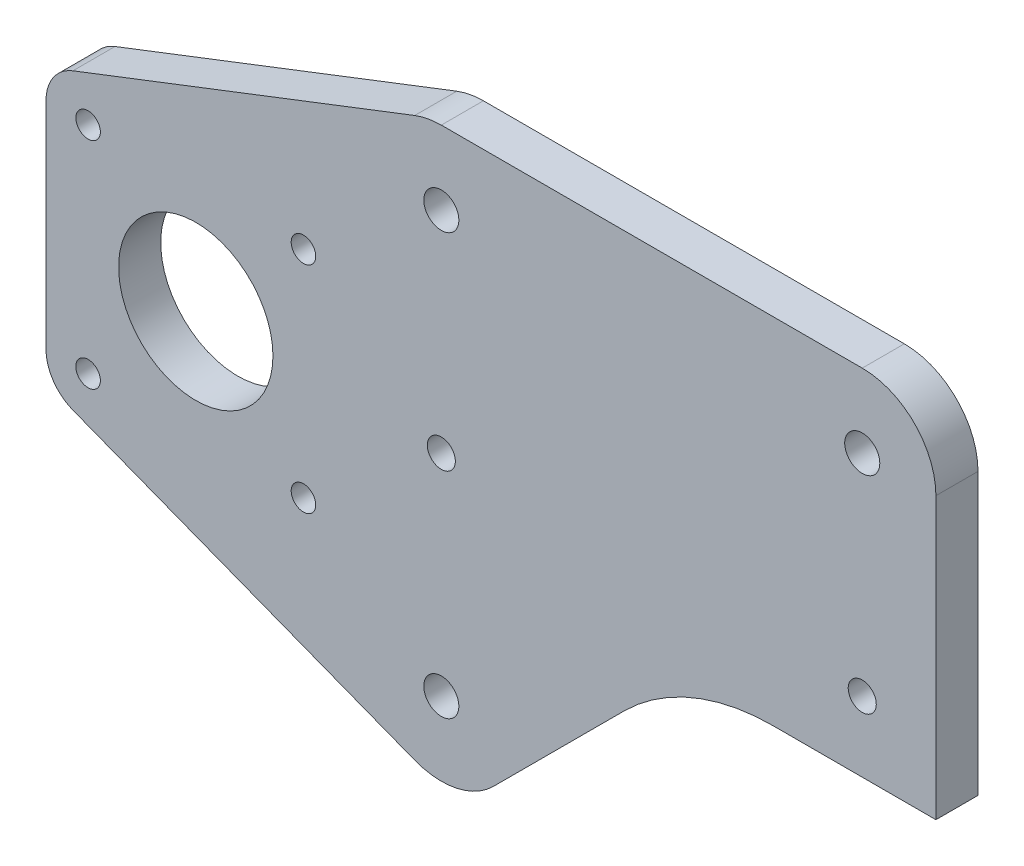
ISO-10303-21;
HEADER;
FILE_DESCRIPTION(('STEP AP214'),'2;1');
FILE_NAME('part.step','',(''),(''),'','','');
FILE_SCHEMA(('AUTOMOTIVE_DESIGN { 1 0 10303 214 1 1 1 1 }'));
ENDSEC;
DATA;
#1=APPLICATION_CONTEXT('core data for automotive mechanical design processes');
#2=APPLICATION_PROTOCOL_DEFINITION('international standard','automotive_design',2000,#1);
#3=PRODUCT_CONTEXT('',#1,'mechanical');
#4=PRODUCT('Part','Part','',(#3));
#5=PRODUCT_RELATED_PRODUCT_CATEGORY('part','',(#4));
#6=PRODUCT_DEFINITION_FORMATION('','',#4);
#7=PRODUCT_DEFINITION_CONTEXT('part definition',#1,'design');
#8=PRODUCT_DEFINITION('design','',#6,#7);
#9=PRODUCT_DEFINITION_SHAPE('','',#8);
#10=(LENGTH_UNIT() NAMED_UNIT(*) SI_UNIT(.MILLI.,.METRE.));
#11=(NAMED_UNIT(*) PLANE_ANGLE_UNIT() SI_UNIT($,.RADIAN.));
#12=(NAMED_UNIT(*) SI_UNIT($,.STERADIAN.) SOLID_ANGLE_UNIT());
#13=UNCERTAINTY_MEASURE_WITH_UNIT(LENGTH_MEASURE(1.E-05),#10,'distance_accuracy_value','');
#14=(GEOMETRIC_REPRESENTATION_CONTEXT(3) GLOBAL_UNCERTAINTY_ASSIGNED_CONTEXT((#13)) GLOBAL_UNIT_ASSIGNED_CONTEXT((#10,
#11,#12)) REPRESENTATION_CONTEXT('',''));
#15=CARTESIAN_POINT('',(0.,0.,0.));
#16=DIRECTION('',(0.,0.,1.));
#17=DIRECTION('',(1.,0.,0.));
#18=AXIS2_PLACEMENT_3D('',#15,#16,#17);
#19=CARTESIAN_POINT('',(17.2756492761104,-40.,6.));
#20=DIRECTION('',(0.,0.,1.));
#21=DIRECTION('',(1.,0.,0.));
#22=AXIS2_PLACEMENT_3D('',#19,#20,#21);
#23=PLANE('',#22);
#24=CARTESIAN_POINT('',(30.,0.,6.));
#25=DIRECTION('',(0.,0.,1.));
#26=DIRECTION('',(1.,0.,0.));
#27=AXIS2_PLACEMENT_3D('',#24,#25,#26);
#28=CIRCLE('',#27,2.);
#29=CARTESIAN_POINT('',(32.,0.,6.));
#30=VERTEX_POINT('',#29);
#31=EDGE_CURVE('E328',#30,#30,#28,.T.);
#32=ORIENTED_EDGE('',*,*,#31,.F.);
#33=EDGE_LOOP('',(#32));
#34=FACE_BOUND('',#33,.T.);
#35=CARTESIAN_POINT('',(-49.6509007052459,-15.3490992947541,6.));
#36=DIRECTION('',(0.,0.,1.));
#37=DIRECTION('',(1.,0.,0.));
#38=AXIS2_PLACEMENT_3D('',#35,#36,#37);
#39=CIRCLE('',#38,1.75);
#40=CARTESIAN_POINT('',(-47.9009007052459,-15.3490992947541,6.));
#41=VERTEX_POINT('',#40);
#42=EDGE_CURVE('E340',#41,#41,#39,.T.);
#43=ORIENTED_EDGE('',*,*,#42,.F.);
#44=EDGE_LOOP('',(#43));
#45=FACE_BOUND('',#44,.T.);
#46=CARTESIAN_POINT('',(-65.,0.,6.));
#47=DIRECTION('',(0.,0.,1.));
#48=DIRECTION('',(1.,0.,0.));
#49=AXIS2_PLACEMENT_3D('',#46,#47,#48);
#50=CIRCLE('',#49,11.);
#51=CARTESIAN_POINT('',(-54.,0.,6.));
#52=VERTEX_POINT('',#51);
#53=EDGE_CURVE('E352',#52,#52,#50,.T.);
#54=ORIENTED_EDGE('',*,*,#53,.F.);
#55=EDGE_LOOP('',(#54));
#56=FACE_BOUND('',#55,.T.);
#57=CARTESIAN_POINT('',(30.,30.,6.));
#58=DIRECTION('',(0.,0.,1.));
#59=DIRECTION('',(1.,0.,0.));
#60=AXIS2_PLACEMENT_3D('',#57,#58,#59);
#61=CIRCLE('',#60,2.5);
#62=CARTESIAN_POINT('',(32.5,30.,6.));
#63=VERTEX_POINT('',#62);
#64=EDGE_CURVE('E364',#63,#63,#61,.T.);
#65=ORIENTED_EDGE('',*,*,#64,.F.);
#66=EDGE_LOOP('',(#65));
#67=FACE_BOUND('',#66,.T.);
#68=CARTESIAN_POINT('',(-30.,30.,6.));
#69=DIRECTION('',(0.,0.,1.));
#70=DIRECTION('',(1.,0.,0.));
#71=AXIS2_PLACEMENT_3D('',#68,#69,#70);
#72=CIRCLE('',#71,2.5);
#73=CARTESIAN_POINT('',(-27.5,30.,6.));
#74=VERTEX_POINT('',#73);
#75=EDGE_CURVE('E164',#74,#74,#72,.T.);
#76=ORIENTED_EDGE('',*,*,#75,.F.);
#77=EDGE_LOOP('',(#76));
#78=FACE_BOUND('',#77,.T.);
#79=CARTESIAN_POINT('',(17.2756492761104,-40.,6.));
#80=DIRECTION('',(0.,0.,-1.));
#81=DIRECTION('',(1.,0.,0.));
#82=AXIS2_PLACEMENT_3D('',#79,#80,#81);
#83=CIRCLE('',#82,30.);
#84=CARTESIAN_POINT('',(-3.93755415948607,-18.7867965644036,6.));
#85=VERTEX_POINT('',#84);
#86=CARTESIAN_POINT('',(17.2756492761104,-10.,6.));
#87=VERTEX_POINT('',#86);
#88=EDGE_CURVE('E185',#85,#87,#83,.T.);
#89=ORIENTED_EDGE('',*,*,#88,.T.);
#90=DIRECTION('',(1.,0.,0.));
#91=VECTOR('',#90,1.);
#92=CARTESIAN_POINT('',(17.2756492761104,-10.,6.));
#93=LINE('',#92,#91);
#94=CARTESIAN_POINT('',(40.5,-10.,6.));
#95=VERTEX_POINT('',#94);
#96=EDGE_CURVE('E108',#87,#95,#93,.T.);
#97=ORIENTED_EDGE('',*,*,#96,.T.);
#98=DIRECTION('',(0.,1.,0.));
#99=VECTOR('',#98,1.);
#100=CARTESIAN_POINT('',(40.5,30.,6.));
#101=LINE('',#100,#99);
#102=CARTESIAN_POINT('',(40.5,30.,6.));
#103=VERTEX_POINT('',#102);
#104=EDGE_CURVE('E215',#95,#103,#101,.T.);
#105=ORIENTED_EDGE('',*,*,#104,.T.);
#106=CARTESIAN_POINT('',(30.,30.,6.));
#107=DIRECTION('',(0.,0.,1.));
#108=DIRECTION('',(1.,0.,0.));
#109=AXIS2_PLACEMENT_3D('',#106,#107,#108);
#110=CIRCLE('',#109,10.5);
#111=CARTESIAN_POINT('',(30.,40.5,6.));
#112=VERTEX_POINT('',#111);
#113=EDGE_CURVE('E234',#103,#112,#110,.T.);
#114=ORIENTED_EDGE('',*,*,#113,.T.);
#115=DIRECTION('',(-1.,0.,0.));
#116=VECTOR('',#115,1.);
#117=CARTESIAN_POINT('',(30.,40.5,6.));
#118=LINE('',#117,#116);
#119=CARTESIAN_POINT('',(-30.,40.5,6.));
#120=VERTEX_POINT('',#119);
#121=EDGE_CURVE('E231',#112,#120,#118,.T.);
#122=ORIENTED_EDGE('',*,*,#121,.T.);
#123=CARTESIAN_POINT('',(-30.,30.,6.));
#124=DIRECTION('',(0.,0.,1.));
#125=DIRECTION('',(1.,0.,0.));
#126=AXIS2_PLACEMENT_3D('',#123,#124,#125);
#127=CIRCLE('',#126,10.5);
#128=CARTESIAN_POINT('',(-33.7880453663849,39.7928909062753,6.));
#129=VERTEX_POINT('',#128);
#130=EDGE_CURVE('E233',#120,#129,#127,.T.);
#131=ORIENTED_EDGE('',*,*,#130,.T.);
#132=DIRECTION('',(-0.932656276788127,-0.360766225369988,0.));
#133=VECTOR('',#132,1.);
#134=CARTESIAN_POINT('',(-33.7880453663849,39.7928909062753,6.));
#135=LINE('',#134,#133);
#136=CARTESIAN_POINT('',(-82.513696646974,20.9450369554829,6.));
#137=VERTEX_POINT('',#136);
#138=EDGE_CURVE('E236',#129,#137,#135,.T.);
#139=ORIENTED_EDGE('',*,*,#138,.T.);
#140=CARTESIAN_POINT('',(-80.3490992947541,15.3490992947541,6.));
#141=DIRECTION('',(0.,0.,1.));
#142=DIRECTION('',(1.,0.,0.));
#143=AXIS2_PLACEMENT_3D('',#140,#141,#142);
#144=CIRCLE('',#143,6.00000000000001);
#145=CARTESIAN_POINT('',(-86.3490992947541,15.3490992947541,6.));
#146=VERTEX_POINT('',#145);
#147=EDGE_CURVE('E242',#137,#146,#144,.T.);
#148=ORIENTED_EDGE('',*,*,#147,.T.);
#149=DIRECTION('',(0.,-1.,0.));
#150=VECTOR('',#149,1.);
#151=CARTESIAN_POINT('',(-86.3490992947541,15.3490992947541,6.));
#152=LINE('',#151,#150);
#153=CARTESIAN_POINT('',(-86.3490992947541,-15.3490992947541,6.));
#154=VERTEX_POINT('',#153);
#155=EDGE_CURVE('E244',#146,#154,#152,.T.);
#156=ORIENTED_EDGE('',*,*,#155,.T.);
#157=CARTESIAN_POINT('',(-80.3490992947541,-15.3490992947541,6.));
#158=DIRECTION('',(0.,0.,1.));
#159=DIRECTION('',(1.,0.,0.));
#160=AXIS2_PLACEMENT_3D('',#157,#158,#159);
#161=CIRCLE('',#160,6.00000000000001);
#162=CARTESIAN_POINT('',(-82.513696646974,-20.9450369554829,6.));
#163=VERTEX_POINT('',#162);
#164=EDGE_CURVE('E142',#154,#163,#161,.T.);
#165=ORIENTED_EDGE('',*,*,#164,.T.);
#166=DIRECTION('',(0.932656276788127,-0.360766225369988,0.));
#167=VECTOR('',#166,1.);
#168=CARTESIAN_POINT('',(-33.7880453663849,-39.7928909062753,6.));
#169=LINE('',#168,#167);
#170=CARTESIAN_POINT('',(-33.7880453663849,-39.7928909062753,6.));
#171=VERTEX_POINT('',#170);
#172=EDGE_CURVE('E136',#163,#171,#169,.T.);
#173=ORIENTED_EDGE('',*,*,#172,.T.);
#174=CARTESIAN_POINT('',(-30.,-30.,6.));
#175=DIRECTION('',(0.,0.,1.));
#176=DIRECTION('',(1.,0.,0.));
#177=AXIS2_PLACEMENT_3D('',#174,#175,#176);
#178=CIRCLE('',#177,10.5);
#179=CARTESIAN_POINT('',(-22.5753787975412,-37.4246212024588,6.));
#180=VERTEX_POINT('',#179);
#181=EDGE_CURVE('E140',#171,#180,#178,.T.);
#182=ORIENTED_EDGE('',*,*,#181,.T.);
#183=DIRECTION('',(0.707106781186548,0.707106781186547,0.));
#184=VECTOR('',#183,1.);
#185=CARTESIAN_POINT('',(-22.5753787975412,-37.4246212024588,6.));
#186=LINE('',#185,#184);
#187=EDGE_CURVE('E50',#180,#85,#186,.T.);
#188=ORIENTED_EDGE('',*,*,#187,.T.);
#189=EDGE_LOOP('',(#89,#97,#105,#114,#122,#131,#139,#148,#156,#165,#173,#182,#188));
#190=FACE_BOUND('',#189,.T.);
#191=CARTESIAN_POINT('',(-30.,-30.,6.));
#192=DIRECTION('',(0.,0.,1.));
#193=DIRECTION('',(1.,0.,0.));
#194=AXIS2_PLACEMENT_3D('',#191,#192,#193);
#195=CIRCLE('',#194,2.5);
#196=CARTESIAN_POINT('',(-27.5,-30.,6.));
#197=VERTEX_POINT('',#196);
#198=EDGE_CURVE('E370',#197,#197,#195,.T.);
#199=ORIENTED_EDGE('',*,*,#198,.F.);
#200=EDGE_LOOP('',(#199));
#201=FACE_BOUND('',#200,.T.);
#202=CARTESIAN_POINT('',(-80.3490992947541,15.3490992947541,6.));
#203=DIRECTION('',(0.,0.,1.));
#204=DIRECTION('',(1.,0.,0.));
#205=AXIS2_PLACEMENT_3D('',#202,#203,#204);
#206=CIRCLE('',#205,1.75);
#207=CARTESIAN_POINT('',(-78.5990992947541,15.3490992947541,6.));
#208=VERTEX_POINT('',#207);
#209=EDGE_CURVE('E358',#208,#208,#206,.T.);
#210=ORIENTED_EDGE('',*,*,#209,.F.);
#211=EDGE_LOOP('',(#210));
#212=FACE_BOUND('',#211,.T.);
#213=CARTESIAN_POINT('',(-49.6509007052459,15.3490992947541,6.));
#214=DIRECTION('',(0.,0.,1.));
#215=DIRECTION('',(1.,0.,0.));
#216=AXIS2_PLACEMENT_3D('',#213,#214,#215);
#217=CIRCLE('',#216,1.75);
#218=CARTESIAN_POINT('',(-47.9009007052459,15.3490992947541,6.));
#219=VERTEX_POINT('',#218);
#220=EDGE_CURVE('E346',#219,#219,#217,.T.);
#221=ORIENTED_EDGE('',*,*,#220,.F.);
#222=EDGE_LOOP('',(#221));
#223=FACE_BOUND('',#222,.T.);
#224=CARTESIAN_POINT('',(-80.3490992947541,-15.3490992947541,6.));
#225=DIRECTION('',(0.,0.,1.));
#226=DIRECTION('',(1.,0.,0.));
#227=AXIS2_PLACEMENT_3D('',#224,#225,#226);
#228=CIRCLE('',#227,1.75);
#229=CARTESIAN_POINT('',(-78.5990992947541,-15.3490992947541,6.));
#230=VERTEX_POINT('',#229);
#231=EDGE_CURVE('E334',#230,#230,#228,.T.);
#232=ORIENTED_EDGE('',*,*,#231,.F.);
#233=EDGE_LOOP('',(#232));
#234=FACE_BOUND('',#233,.T.);
#235=CARTESIAN_POINT('',(-30.,0.,6.));
#236=DIRECTION('',(0.,0.,1.));
#237=DIRECTION('',(1.,0.,0.));
#238=AXIS2_PLACEMENT_3D('',#235,#236,#237);
#239=CIRCLE('',#238,2.);
#240=CARTESIAN_POINT('',(-28.,0.,6.));
#241=VERTEX_POINT('',#240);
#242=EDGE_CURVE('E319',#241,#241,#239,.T.);
#243=ORIENTED_EDGE('',*,*,#242,.F.);
#244=EDGE_LOOP('',(#243));
#245=FACE_BOUND('',#244,.T.);
#246=ADVANCED_FACE('F33',(#34,#45,#56,#67,#78,#190,#201,#212,#223,#234,#245),#23,.T.);
#247=CARTESIAN_POINT('',(17.2756492761104,-40.,0.));
#248=DIRECTION('',(0.,0.,1.));
#249=DIRECTION('',(1.,0.,0.));
#250=AXIS2_PLACEMENT_3D('',#247,#248,#249);
#251=PLANE('',#250);
#252=CARTESIAN_POINT('',(17.2756492761104,-40.,0.));
#253=DIRECTION('',(0.,0.,-1.));
#254=DIRECTION('',(1.,0.,0.));
#255=AXIS2_PLACEMENT_3D('',#252,#253,#254);
#256=CIRCLE('',#255,30.);
#257=CARTESIAN_POINT('',(-3.93755415948607,-18.7867965644036,0.));
#258=VERTEX_POINT('',#257);
#259=CARTESIAN_POINT('',(17.2756492761104,-10.,0.));
#260=VERTEX_POINT('',#259);
#261=EDGE_CURVE('E160',#258,#260,#256,.T.);
#262=ORIENTED_EDGE('',*,*,#261,.F.);
#263=DIRECTION('',(0.707106781186548,0.707106781186547,0.));
#264=VECTOR('',#263,1.);
#265=CARTESIAN_POINT('',(-22.5753787975412,-37.4246212024588,0.));
#266=LINE('',#265,#264);
#267=CARTESIAN_POINT('',(-22.5753787975412,-37.4246212024588,0.));
#268=VERTEX_POINT('',#267);
#269=EDGE_CURVE('E100',#268,#258,#266,.T.);
#270=ORIENTED_EDGE('',*,*,#269,.F.);
#271=CARTESIAN_POINT('',(-30.,-30.,0.));
#272=DIRECTION('',(0.,0.,1.));
#273=DIRECTION('',(1.,0.,0.));
#274=AXIS2_PLACEMENT_3D('',#271,#272,#273);
#275=CIRCLE('',#274,10.5);
#276=CARTESIAN_POINT('',(-33.7880453663849,-39.7928909062753,0.));
#277=VERTEX_POINT('',#276);
#278=EDGE_CURVE('E94',#277,#268,#275,.T.);
#279=ORIENTED_EDGE('',*,*,#278,.F.);
#280=DIRECTION('',(0.932656276788127,-0.360766225369988,0.));
#281=VECTOR('',#280,1.);
#282=CARTESIAN_POINT('',(-33.7880453663849,-39.7928909062753,0.));
#283=LINE('',#282,#281);
#284=CARTESIAN_POINT('',(-82.513696646974,-20.9450369554829,0.));
#285=VERTEX_POINT('',#284);
#286=EDGE_CURVE('E150',#285,#277,#283,.T.);
#287=ORIENTED_EDGE('',*,*,#286,.F.);
#288=CARTESIAN_POINT('',(-80.3490992947541,-15.3490992947541,0.));
#289=DIRECTION('',(0.,0.,1.));
#290=DIRECTION('',(1.,0.,0.));
#291=AXIS2_PLACEMENT_3D('',#288,#289,#290);
#292=CIRCLE('',#291,6.00000000000001);
#293=CARTESIAN_POINT('',(-86.3490992947541,-15.3490992947541,0.));
#294=VERTEX_POINT('',#293);
#295=EDGE_CURVE('E180',#294,#285,#292,.T.);
#296=ORIENTED_EDGE('',*,*,#295,.F.);
#297=DIRECTION('',(0.,-1.,0.));
#298=VECTOR('',#297,1.);
#299=CARTESIAN_POINT('',(-86.3490992947541,15.3490992947541,0.));
#300=LINE('',#299,#298);
#301=CARTESIAN_POINT('',(-86.3490992947541,15.3490992947541,0.));
#302=VERTEX_POINT('',#301);
#303=EDGE_CURVE('E178',#302,#294,#300,.T.);
#304=ORIENTED_EDGE('',*,*,#303,.F.);
#305=CARTESIAN_POINT('',(-80.3490992947541,15.3490992947541,0.));
#306=DIRECTION('',(0.,0.,1.));
#307=DIRECTION('',(1.,0.,0.));
#308=AXIS2_PLACEMENT_3D('',#305,#306,#307);
#309=CIRCLE('',#308,6.00000000000001);
#310=CARTESIAN_POINT('',(-82.513696646974,20.9450369554829,0.));
#311=VERTEX_POINT('',#310);
#312=EDGE_CURVE('E176',#311,#302,#309,.T.);
#313=ORIENTED_EDGE('',*,*,#312,.F.);
#314=DIRECTION('',(-0.932656276788127,-0.360766225369988,0.));
#315=VECTOR('',#314,1.);
#316=CARTESIAN_POINT('',(-33.7880453663849,39.7928909062753,0.));
#317=LINE('',#316,#315);
#318=CARTESIAN_POINT('',(-33.7880453663849,39.7928909062753,0.));
#319=VERTEX_POINT('',#318);
#320=EDGE_CURVE('E174',#319,#311,#317,.T.);
#321=ORIENTED_EDGE('',*,*,#320,.F.);
#322=CARTESIAN_POINT('',(-30.,30.,0.));
#323=DIRECTION('',(0.,0.,1.));
#324=DIRECTION('',(1.,0.,0.));
#325=AXIS2_PLACEMENT_3D('',#322,#323,#324);
#326=CIRCLE('',#325,10.5);
#327=CARTESIAN_POINT('',(-30.,40.5,0.));
#328=VERTEX_POINT('',#327);
#329=EDGE_CURVE('E172',#328,#319,#326,.T.);
#330=ORIENTED_EDGE('',*,*,#329,.F.);
#331=DIRECTION('',(-1.,0.,0.));
#332=VECTOR('',#331,1.);
#333=CARTESIAN_POINT('',(30.,40.5,0.));
#334=LINE('',#333,#332);
#335=CARTESIAN_POINT('',(30.,40.5,0.));
#336=VERTEX_POINT('',#335);
#337=EDGE_CURVE('E170',#336,#328,#334,.T.);
#338=ORIENTED_EDGE('',*,*,#337,.F.);
#339=CARTESIAN_POINT('',(30.,30.,0.));
#340=DIRECTION('',(0.,0.,1.));
#341=DIRECTION('',(1.,0.,0.));
#342=AXIS2_PLACEMENT_3D('',#339,#340,#341);
#343=CIRCLE('',#342,10.5);
#344=CARTESIAN_POINT('',(40.5,30.,0.));
#345=VERTEX_POINT('',#344);
#346=EDGE_CURVE('E168',#345,#336,#343,.T.);
#347=ORIENTED_EDGE('',*,*,#346,.F.);
#348=DIRECTION('',(0.,1.,0.));
#349=VECTOR('',#348,1.);
#350=CARTESIAN_POINT('',(40.5,30.,0.));
#351=LINE('',#350,#349);
#352=CARTESIAN_POINT('',(40.5,-10.,0.));
#353=VERTEX_POINT('',#352);
#354=EDGE_CURVE('E166',#353,#345,#351,.T.);
#355=ORIENTED_EDGE('',*,*,#354,.F.);
#356=DIRECTION('',(1.,0.,0.));
#357=VECTOR('',#356,1.);
#358=CARTESIAN_POINT('',(17.2756492761104,-10.,0.));
#359=LINE('',#358,#357);
#360=EDGE_CURVE('E163',#260,#353,#359,.T.);
#361=ORIENTED_EDGE('',*,*,#360,.F.);
#362=EDGE_LOOP('',(#262,#270,#279,#287,#296,#304,#313,#321,#330,#338,#347,#355,#361));
#363=FACE_BOUND('',#362,.T.);
#364=CARTESIAN_POINT('',(-30.,30.,0.));
#365=DIRECTION('',(0.,0.,1.));
#366=DIRECTION('',(1.,0.,0.));
#367=AXIS2_PLACEMENT_3D('',#364,#365,#366);
#368=CIRCLE('',#367,2.5);
#369=CARTESIAN_POINT('',(-27.5,30.,0.));
#370=VERTEX_POINT('',#369);
#371=EDGE_CURVE('E373',#370,#370,#368,.T.);
#372=ORIENTED_EDGE('',*,*,#371,.T.);
#373=EDGE_LOOP('',(#372));
#374=FACE_BOUND('',#373,.T.);
#375=CARTESIAN_POINT('',(-30.,-30.,0.));
#376=DIRECTION('',(0.,0.,1.));
#377=DIRECTION('',(1.,0.,0.));
#378=AXIS2_PLACEMENT_3D('',#375,#376,#377);
#379=CIRCLE('',#378,2.5);
#380=CARTESIAN_POINT('',(-27.5,-30.,0.));
#381=VERTEX_POINT('',#380);
#382=EDGE_CURVE('E367',#381,#381,#379,.T.);
#383=ORIENTED_EDGE('',*,*,#382,.T.);
#384=EDGE_LOOP('',(#383));
#385=FACE_BOUND('',#384,.T.);
#386=CARTESIAN_POINT('',(30.,30.,0.));
#387=DIRECTION('',(0.,0.,1.));
#388=DIRECTION('',(1.,0.,0.));
#389=AXIS2_PLACEMENT_3D('',#386,#387,#388);
#390=CIRCLE('',#389,2.5);
#391=CARTESIAN_POINT('',(32.5,30.,0.));
#392=VERTEX_POINT('',#391);
#393=EDGE_CURVE('E361',#392,#392,#390,.T.);
#394=ORIENTED_EDGE('',*,*,#393,.T.);
#395=EDGE_LOOP('',(#394));
#396=FACE_BOUND('',#395,.T.);
#397=CARTESIAN_POINT('',(-80.3490992947541,15.3490992947541,0.));
#398=DIRECTION('',(0.,0.,1.));
#399=DIRECTION('',(1.,0.,0.));
#400=AXIS2_PLACEMENT_3D('',#397,#398,#399);
#401=CIRCLE('',#400,1.75);
#402=CARTESIAN_POINT('',(-78.5990992947541,15.3490992947541,0.));
#403=VERTEX_POINT('',#402);
#404=EDGE_CURVE('E355',#403,#403,#401,.T.);
#405=ORIENTED_EDGE('',*,*,#404,.T.);
#406=EDGE_LOOP('',(#405));
#407=FACE_BOUND('',#406,.T.);
#408=CARTESIAN_POINT('',(-65.,0.,0.));
#409=DIRECTION('',(0.,0.,1.));
#410=DIRECTION('',(1.,0.,0.));
#411=AXIS2_PLACEMENT_3D('',#408,#409,#410);
#412=CIRCLE('',#411,11.);
#413=CARTESIAN_POINT('',(-54.,0.,0.));
#414=VERTEX_POINT('',#413);
#415=EDGE_CURVE('E349',#414,#414,#412,.T.);
#416=ORIENTED_EDGE('',*,*,#415,.T.);
#417=EDGE_LOOP('',(#416));
#418=FACE_BOUND('',#417,.T.);
#419=CARTESIAN_POINT('',(-49.6509007052459,15.3490992947541,0.));
#420=DIRECTION('',(0.,0.,1.));
#421=DIRECTION('',(1.,0.,0.));
#422=AXIS2_PLACEMENT_3D('',#419,#420,#421);
#423=CIRCLE('',#422,1.75);
#424=CARTESIAN_POINT('',(-47.9009007052459,15.3490992947541,0.));
#425=VERTEX_POINT('',#424);
#426=EDGE_CURVE('E343',#425,#425,#423,.T.);
#427=ORIENTED_EDGE('',*,*,#426,.T.);
#428=EDGE_LOOP('',(#427));
#429=FACE_BOUND('',#428,.T.);
#430=CARTESIAN_POINT('',(-49.6509007052459,-15.3490992947541,0.));
#431=DIRECTION('',(0.,0.,1.));
#432=DIRECTION('',(1.,0.,0.));
#433=AXIS2_PLACEMENT_3D('',#430,#431,#432);
#434=CIRCLE('',#433,1.75);
#435=CARTESIAN_POINT('',(-47.9009007052459,-15.3490992947541,0.));
#436=VERTEX_POINT('',#435);
#437=EDGE_CURVE('E337',#436,#436,#434,.T.);
#438=ORIENTED_EDGE('',*,*,#437,.T.);
#439=EDGE_LOOP('',(#438));
#440=FACE_BOUND('',#439,.T.);
#441=CARTESIAN_POINT('',(-80.3490992947541,-15.3490992947541,0.));
#442=DIRECTION('',(0.,0.,1.));
#443=DIRECTION('',(1.,0.,0.));
#444=AXIS2_PLACEMENT_3D('',#441,#442,#443);
#445=CIRCLE('',#444,1.75);
#446=CARTESIAN_POINT('',(-78.5990992947541,-15.3490992947541,0.));
#447=VERTEX_POINT('',#446);
#448=EDGE_CURVE('E331',#447,#447,#445,.T.);
#449=ORIENTED_EDGE('',*,*,#448,.T.);
#450=EDGE_LOOP('',(#449));
#451=FACE_BOUND('',#450,.T.);
#452=CARTESIAN_POINT('',(30.,0.,0.));
#453=DIRECTION('',(0.,0.,1.));
#454=DIRECTION('',(1.,0.,0.));
#455=AXIS2_PLACEMENT_3D('',#452,#453,#454);
#456=CIRCLE('',#455,2.);
#457=CARTESIAN_POINT('',(32.,0.,0.));
#458=VERTEX_POINT('',#457);
#459=EDGE_CURVE('E325',#458,#458,#456,.T.);
#460=ORIENTED_EDGE('',*,*,#459,.T.);
#461=EDGE_LOOP('',(#460));
#462=FACE_BOUND('',#461,.T.);
#463=CARTESIAN_POINT('',(-30.,0.,0.));
#464=DIRECTION('',(0.,0.,1.));
#465=DIRECTION('',(1.,0.,0.));
#466=AXIS2_PLACEMENT_3D('',#463,#464,#465);
#467=CIRCLE('',#466,2.);
#468=CARTESIAN_POINT('',(-28.,0.,0.));
#469=VERTEX_POINT('',#468);
#470=EDGE_CURVE('E322',#469,#469,#467,.T.);
#471=ORIENTED_EDGE('',*,*,#470,.T.);
#472=EDGE_LOOP('',(#471));
#473=FACE_BOUND('',#472,.T.);
#474=ADVANCED_FACE('F219',(#363,#374,#385,#396,#407,#418,#429,#440,#451,#462,#473),#251,.F.);
#475=CARTESIAN_POINT('',(17.2756492761104,-40.,6.));
#476=DIRECTION('',(0.,0.,-1.));
#477=DIRECTION('',(-1.,0.,0.));
#478=AXIS2_PLACEMENT_3D('',#475,#476,#477);
#479=CYLINDRICAL_SURFACE('',#478,30.);
#480=ORIENTED_EDGE('',*,*,#261,.T.);
#481=DIRECTION('',(0.,0.,-1.));
#482=VECTOR('',#481,1.);
#483=CARTESIAN_POINT('',(17.2756492761104,-10.,6.));
#484=LINE('',#483,#482);
#485=EDGE_CURVE('E11',#87,#260,#484,.T.);
#486=ORIENTED_EDGE('',*,*,#485,.F.);
#487=ORIENTED_EDGE('',*,*,#88,.F.);
#488=DIRECTION('',(0.,0.,-1.));
#489=VECTOR('',#488,1.);
#490=CARTESIAN_POINT('',(-3.93755415948607,-18.7867965644036,6.));
#491=LINE('',#490,#489);
#492=EDGE_CURVE('E156',#85,#258,#491,.T.);
#493=ORIENTED_EDGE('',*,*,#492,.T.);
#494=EDGE_LOOP('',(#480,#486,#487,#493));
#495=FACE_BOUND('',#494,.T.);
#496=ADVANCED_FACE('F35',(#495),#479,.F.);
#497=CARTESIAN_POINT('',(17.2756492761104,-10.,6.));
#498=DIRECTION('',(0.,1.,0.));
#499=DIRECTION('',(-1.,0.,0.));
#500=AXIS2_PLACEMENT_3D('',#497,#498,#499);
#501=PLANE('',#500);
#502=ORIENTED_EDGE('',*,*,#360,.T.);
#503=DIRECTION('',(0.,0.,-1.));
#504=VECTOR('',#503,1.);
#505=CARTESIAN_POINT('',(40.5,-10.,6.));
#506=LINE('',#505,#504);
#507=EDGE_CURVE('E42',#95,#353,#506,.T.);
#508=ORIENTED_EDGE('',*,*,#507,.F.);
#509=ORIENTED_EDGE('',*,*,#96,.F.);
#510=ORIENTED_EDGE('',*,*,#485,.T.);
#511=EDGE_LOOP('',(#502,#508,#509,#510));
#512=FACE_BOUND('',#511,.T.);
#513=ADVANCED_FACE('F547',(#512),#501,.F.);
#514=CARTESIAN_POINT('',(40.5,30.,6.));
#515=DIRECTION('',(-1.,0.,0.));
#516=DIRECTION('',(0.,-1.,0.));
#517=AXIS2_PLACEMENT_3D('',#514,#515,#516);
#518=PLANE('',#517);
#519=ORIENTED_EDGE('',*,*,#354,.T.);
#520=DIRECTION('',(0.,0.,-1.));
#521=VECTOR('',#520,1.);
#522=CARTESIAN_POINT('',(40.5,30.,6.));
#523=LINE('',#522,#521);
#524=EDGE_CURVE('E207',#103,#345,#523,.T.);
#525=ORIENTED_EDGE('',*,*,#524,.F.);
#526=ORIENTED_EDGE('',*,*,#104,.F.);
#527=ORIENTED_EDGE('',*,*,#507,.T.);
#528=EDGE_LOOP('',(#519,#525,#526,#527));
#529=FACE_BOUND('',#528,.T.);
#530=ADVANCED_FACE('F213',(#529),#518,.F.);
#531=CARTESIAN_POINT('',(30.,30.,6.));
#532=DIRECTION('',(0.,0.,-1.));
#533=DIRECTION('',(-1.,0.,0.));
#534=AXIS2_PLACEMENT_3D('',#531,#532,#533);
#535=CYLINDRICAL_SURFACE('',#534,10.5);
#536=ORIENTED_EDGE('',*,*,#346,.T.);
#537=DIRECTION('',(0.,0.,-1.));
#538=VECTOR('',#537,1.);
#539=CARTESIAN_POINT('',(30.,40.5,6.));
#540=LINE('',#539,#538);
#541=EDGE_CURVE('E204',#112,#336,#540,.T.);
#542=ORIENTED_EDGE('',*,*,#541,.F.);
#543=ORIENTED_EDGE('',*,*,#113,.F.);
#544=ORIENTED_EDGE('',*,*,#524,.T.);
#545=EDGE_LOOP('',(#536,#542,#543,#544));
#546=FACE_BOUND('',#545,.T.);
#547=ADVANCED_FACE('F225',(#546),#535,.T.);
#548=CARTESIAN_POINT('',(30.,40.5,6.));
#549=DIRECTION('',(0.,-1.,0.));
#550=DIRECTION('',(0.,0.,-1.));
#551=AXIS2_PLACEMENT_3D('',#548,#549,#550);
#552=PLANE('',#551);
#553=ORIENTED_EDGE('',*,*,#337,.T.);
#554=DIRECTION('',(0.,0.,-1.));
#555=VECTOR('',#554,1.);
#556=CARTESIAN_POINT('',(-30.,40.5,6.));
#557=LINE('',#556,#555);
#558=EDGE_CURVE('E201',#120,#328,#557,.T.);
#559=ORIENTED_EDGE('',*,*,#558,.F.);
#560=ORIENTED_EDGE('',*,*,#121,.F.);
#561=ORIENTED_EDGE('',*,*,#541,.T.);
#562=EDGE_LOOP('',(#553,#559,#560,#561));
#563=FACE_BOUND('',#562,.T.);
#564=ADVANCED_FACE('F229',(#563),#552,.F.);
#565=CARTESIAN_POINT('',(-30.,30.,6.));
#566=DIRECTION('',(0.,0.,-1.));
#567=DIRECTION('',(-1.,0.,0.));
#568=AXIS2_PLACEMENT_3D('',#565,#566,#567);
#569=CYLINDRICAL_SURFACE('',#568,10.5);
#570=ORIENTED_EDGE('',*,*,#329,.T.);
#571=DIRECTION('',(0.,0.,-1.));
#572=VECTOR('',#571,1.);
#573=CARTESIAN_POINT('',(-33.7880453663849,39.7928909062753,6.));
#574=LINE('',#573,#572);
#575=EDGE_CURVE('E198',#129,#319,#574,.T.);
#576=ORIENTED_EDGE('',*,*,#575,.F.);
#577=ORIENTED_EDGE('',*,*,#130,.F.);
#578=ORIENTED_EDGE('',*,*,#558,.T.);
#579=EDGE_LOOP('',(#570,#576,#577,#578));
#580=FACE_BOUND('',#579,.T.);
#581=ADVANCED_FACE('F512',(#580),#569,.T.);
#582=CARTESIAN_POINT('',(-33.7880453663849,39.7928909062753,6.));
#583=DIRECTION('',(0.360766225369988,-0.932656276788127,0.));
#584=DIRECTION('',(0.932656276788127,0.360766225369988,0.));
#585=AXIS2_PLACEMENT_3D('',#582,#583,#584);
#586=PLANE('',#585);
#587=ORIENTED_EDGE('',*,*,#320,.T.);
#588=DIRECTION('',(0.,0.,-1.));
#589=VECTOR('',#588,1.);
#590=CARTESIAN_POINT('',(-82.513696646974,20.9450369554829,6.));
#591=LINE('',#590,#589);
#592=EDGE_CURVE('E195',#137,#311,#591,.T.);
#593=ORIENTED_EDGE('',*,*,#592,.F.);
#594=ORIENTED_EDGE('',*,*,#138,.F.);
#595=ORIENTED_EDGE('',*,*,#575,.T.);
#596=EDGE_LOOP('',(#587,#593,#594,#595));
#597=FACE_BOUND('',#596,.T.);
#598=ADVANCED_FACE('F502',(#597),#586,.F.);
#599=CARTESIAN_POINT('',(-80.3490992947541,15.3490992947541,6.));
#600=DIRECTION('',(0.,0.,-1.));
#601=DIRECTION('',(-1.,0.,0.));
#602=AXIS2_PLACEMENT_3D('',#599,#600,#601);
#603=CYLINDRICAL_SURFACE('',#602,6.00000000000001);
#604=ORIENTED_EDGE('',*,*,#312,.T.);
#605=DIRECTION('',(0.,0.,-1.));
#606=VECTOR('',#605,1.);
#607=CARTESIAN_POINT('',(-86.3490992947541,15.3490992947541,6.));
#608=LINE('',#607,#606);
#609=EDGE_CURVE('E192',#146,#302,#608,.T.);
#610=ORIENTED_EDGE('',*,*,#609,.F.);
#611=ORIENTED_EDGE('',*,*,#147,.F.);
#612=ORIENTED_EDGE('',*,*,#592,.T.);
#613=EDGE_LOOP('',(#604,#610,#611,#612));
#614=FACE_BOUND('',#613,.T.);
#615=ADVANCED_FACE('F493',(#614),#603,.T.);
#616=CARTESIAN_POINT('',(-86.3490992947541,15.3490992947541,6.));
#617=DIRECTION('',(1.,0.,0.));
#618=DIRECTION('',(0.,0.,-1.));
#619=AXIS2_PLACEMENT_3D('',#616,#617,#618);
#620=PLANE('',#619);
#621=ORIENTED_EDGE('',*,*,#303,.T.);
#622=DIRECTION('',(0.,0.,-1.));
#623=VECTOR('',#622,1.);
#624=CARTESIAN_POINT('',(-86.3490992947541,-15.3490992947541,6.));
#625=LINE('',#624,#623);
#626=EDGE_CURVE('E189',#154,#294,#625,.T.);
#627=ORIENTED_EDGE('',*,*,#626,.F.);
#628=ORIENTED_EDGE('',*,*,#155,.F.);
#629=ORIENTED_EDGE('',*,*,#609,.T.);
#630=EDGE_LOOP('',(#621,#627,#628,#629));
#631=FACE_BOUND('',#630,.T.);
#632=ADVANCED_FACE('F250',(#631),#620,.F.);
#633=CARTESIAN_POINT('',(-80.3490992947541,-15.3490992947541,6.));
#634=DIRECTION('',(0.,0.,-1.));
#635=DIRECTION('',(-1.,0.,0.));
#636=AXIS2_PLACEMENT_3D('',#633,#634,#635);
#637=CYLINDRICAL_SURFACE('',#636,6.00000000000001);
#638=ORIENTED_EDGE('',*,*,#295,.T.);
#639=DIRECTION('',(0.,0.,-1.));
#640=VECTOR('',#639,1.);
#641=CARTESIAN_POINT('',(-82.513696646974,-20.9450369554829,6.));
#642=LINE('',#641,#640);
#643=EDGE_CURVE('E151',#163,#285,#642,.T.);
#644=ORIENTED_EDGE('',*,*,#643,.F.);
#645=ORIENTED_EDGE('',*,*,#164,.F.);
#646=ORIENTED_EDGE('',*,*,#626,.T.);
#647=EDGE_LOOP('',(#638,#644,#645,#646));
#648=FACE_BOUND('',#647,.T.);
#649=ADVANCED_FACE('F254',(#648),#637,.T.);
#650=CARTESIAN_POINT('',(-33.7880453663849,-39.7928909062753,6.));
#651=DIRECTION('',(0.360766225369988,0.932656276788127,0.));
#652=DIRECTION('',(-0.932656276788127,0.360766225369988,0.));
#653=AXIS2_PLACEMENT_3D('',#650,#651,#652);
#654=PLANE('',#653);
#655=ORIENTED_EDGE('',*,*,#286,.T.);
#656=DIRECTION('',(0.,0.,-1.));
#657=VECTOR('',#656,1.);
#658=CARTESIAN_POINT('',(-33.7880453663849,-39.7928909062753,6.));
#659=LINE('',#658,#657);
#660=EDGE_CURVE('E147',#171,#277,#659,.T.);
#661=ORIENTED_EDGE('',*,*,#660,.F.);
#662=ORIENTED_EDGE('',*,*,#172,.F.);
#663=ORIENTED_EDGE('',*,*,#643,.T.);
#664=EDGE_LOOP('',(#655,#661,#662,#663));
#665=FACE_BOUND('',#664,.T.);
#666=ADVANCED_FACE('F148',(#665),#654,.F.);
#667=CARTESIAN_POINT('',(-30.,-30.,6.));
#668=DIRECTION('',(0.,0.,-1.));
#669=DIRECTION('',(-1.,0.,0.));
#670=AXIS2_PLACEMENT_3D('',#667,#668,#669);
#671=CYLINDRICAL_SURFACE('',#670,10.5);
#672=ORIENTED_EDGE('',*,*,#278,.T.);
#673=DIRECTION('',(0.,0.,-1.));
#674=VECTOR('',#673,1.);
#675=CARTESIAN_POINT('',(-22.5753787975412,-37.4246212024588,6.));
#676=LINE('',#675,#674);
#677=EDGE_CURVE('E152',#180,#268,#676,.T.);
#678=ORIENTED_EDGE('',*,*,#677,.F.);
#679=ORIENTED_EDGE('',*,*,#181,.F.);
#680=ORIENTED_EDGE('',*,*,#660,.T.);
#681=EDGE_LOOP('',(#672,#678,#679,#680));
#682=FACE_BOUND('',#681,.T.);
#683=ADVANCED_FACE('F154',(#682),#671,.T.);
#684=CARTESIAN_POINT('',(-22.5753787975412,-37.4246212024588,6.));
#685=DIRECTION('',(-0.707106781186547,0.707106781186548,0.));
#686=DIRECTION('',(-0.707106781186548,-0.707106781186547,0.));
#687=AXIS2_PLACEMENT_3D('',#684,#685,#686);
#688=PLANE('',#687);
#689=ORIENTED_EDGE('',*,*,#269,.T.);
#690=ORIENTED_EDGE('',*,*,#492,.F.);
#691=ORIENTED_EDGE('',*,*,#187,.F.);
#692=ORIENTED_EDGE('',*,*,#677,.T.);
#693=EDGE_LOOP('',(#689,#690,#691,#692));
#694=FACE_BOUND('',#693,.T.);
#695=ADVANCED_FACE('F258',(#694),#688,.F.);
#696=CARTESIAN_POINT('',(-30.,30.,6.));
#697=DIRECTION('',(0.,0.,-1.));
#698=DIRECTION('',(-1.,0.,0.));
#699=AXIS2_PLACEMENT_3D('',#696,#697,#698);
#700=CYLINDRICAL_SURFACE('',#699,2.5);
#701=ORIENTED_EDGE('',*,*,#75,.T.);
#702=EDGE_LOOP('',(#701));
#703=FACE_BOUND('',#702,.T.);
#704=ORIENTED_EDGE('',*,*,#371,.F.);
#705=EDGE_LOOP('',(#704));
#706=FACE_BOUND('',#705,.T.);
#707=ADVANCED_FACE('F260',(#703,#706),#700,.F.);
#708=CARTESIAN_POINT('',(-30.,-30.,6.));
#709=DIRECTION('',(0.,0.,-1.));
#710=DIRECTION('',(-1.,0.,0.));
#711=AXIS2_PLACEMENT_3D('',#708,#709,#710);
#712=CYLINDRICAL_SURFACE('',#711,2.5);
#713=ORIENTED_EDGE('',*,*,#198,.T.);
#714=EDGE_LOOP('',(#713));
#715=FACE_BOUND('',#714,.T.);
#716=ORIENTED_EDGE('',*,*,#382,.F.);
#717=EDGE_LOOP('',(#716));
#718=FACE_BOUND('',#717,.T.);
#719=ADVANCED_FACE('F266',(#715,#718),#712,.F.);
#720=CARTESIAN_POINT('',(30.,30.,6.));
#721=DIRECTION('',(0.,0.,-1.));
#722=DIRECTION('',(-1.,0.,0.));
#723=AXIS2_PLACEMENT_3D('',#720,#721,#722);
#724=CYLINDRICAL_SURFACE('',#723,2.5);
#725=ORIENTED_EDGE('',*,*,#64,.T.);
#726=EDGE_LOOP('',(#725));
#727=FACE_BOUND('',#726,.T.);
#728=ORIENTED_EDGE('',*,*,#393,.F.);
#729=EDGE_LOOP('',(#728));
#730=FACE_BOUND('',#729,.T.);
#731=ADVANCED_FACE('F282',(#727,#730),#724,.F.);
#732=CARTESIAN_POINT('',(-80.3490992947541,15.3490992947541,6.));
#733=DIRECTION('',(0.,0.,-1.));
#734=DIRECTION('',(-1.,0.,0.));
#735=AXIS2_PLACEMENT_3D('',#732,#733,#734);
#736=CYLINDRICAL_SURFACE('',#735,1.75);
#737=ORIENTED_EDGE('',*,*,#209,.T.);
#738=EDGE_LOOP('',(#737));
#739=FACE_BOUND('',#738,.T.);
#740=ORIENTED_EDGE('',*,*,#404,.F.);
#741=EDGE_LOOP('',(#740));
#742=FACE_BOUND('',#741,.T.);
#743=ADVANCED_FACE('F286',(#739,#742),#736,.F.);
#744=CARTESIAN_POINT('',(-65.,0.,6.));
#745=DIRECTION('',(0.,0.,-1.));
#746=DIRECTION('',(-1.,0.,0.));
#747=AXIS2_PLACEMENT_3D('',#744,#745,#746);
#748=CYLINDRICAL_SURFACE('',#747,11.);
#749=ORIENTED_EDGE('',*,*,#53,.T.);
#750=EDGE_LOOP('',(#749));
#751=FACE_BOUND('',#750,.T.);
#752=ORIENTED_EDGE('',*,*,#415,.F.);
#753=EDGE_LOOP('',(#752));
#754=FACE_BOUND('',#753,.T.);
#755=ADVANCED_FACE('F290',(#751,#754),#748,.F.);
#756=CARTESIAN_POINT('',(-49.6509007052459,15.3490992947541,6.));
#757=DIRECTION('',(0.,0.,-1.));
#758=DIRECTION('',(-1.,0.,0.));
#759=AXIS2_PLACEMENT_3D('',#756,#757,#758);
#760=CYLINDRICAL_SURFACE('',#759,1.75);
#761=ORIENTED_EDGE('',*,*,#220,.T.);
#762=EDGE_LOOP('',(#761));
#763=FACE_BOUND('',#762,.T.);
#764=ORIENTED_EDGE('',*,*,#426,.F.);
#765=EDGE_LOOP('',(#764));
#766=FACE_BOUND('',#765,.T.);
#767=ADVANCED_FACE('F294',(#763,#766),#760,.F.);
#768=CARTESIAN_POINT('',(-49.6509007052459,-15.3490992947541,6.));
#769=DIRECTION('',(0.,0.,-1.));
#770=DIRECTION('',(-1.,0.,0.));
#771=AXIS2_PLACEMENT_3D('',#768,#769,#770);
#772=CYLINDRICAL_SURFACE('',#771,1.75);
#773=ORIENTED_EDGE('',*,*,#42,.T.);
#774=EDGE_LOOP('',(#773));
#775=FACE_BOUND('',#774,.T.);
#776=ORIENTED_EDGE('',*,*,#437,.F.);
#777=EDGE_LOOP('',(#776));
#778=FACE_BOUND('',#777,.T.);
#779=ADVANCED_FACE('F298',(#775,#778),#772,.F.);
#780=CARTESIAN_POINT('',(-80.3490992947541,-15.3490992947541,6.));
#781=DIRECTION('',(0.,0.,-1.));
#782=DIRECTION('',(-1.,0.,0.));
#783=AXIS2_PLACEMENT_3D('',#780,#781,#782);
#784=CYLINDRICAL_SURFACE('',#783,1.75);
#785=ORIENTED_EDGE('',*,*,#231,.T.);
#786=EDGE_LOOP('',(#785));
#787=FACE_BOUND('',#786,.T.);
#788=ORIENTED_EDGE('',*,*,#448,.F.);
#789=EDGE_LOOP('',(#788));
#790=FACE_BOUND('',#789,.T.);
#791=ADVANCED_FACE('F302',(#787,#790),#784,.F.);
#792=CARTESIAN_POINT('',(30.,0.,6.));
#793=DIRECTION('',(0.,0.,-1.));
#794=DIRECTION('',(-1.,0.,0.));
#795=AXIS2_PLACEMENT_3D('',#792,#793,#794);
#796=CYLINDRICAL_SURFACE('',#795,2.);
#797=ORIENTED_EDGE('',*,*,#31,.T.);
#798=EDGE_LOOP('',(#797));
#799=FACE_BOUND('',#798,.T.);
#800=ORIENTED_EDGE('',*,*,#459,.F.);
#801=EDGE_LOOP('',(#800));
#802=FACE_BOUND('',#801,.T.);
#803=ADVANCED_FACE('F306',(#799,#802),#796,.F.);
#804=CARTESIAN_POINT('',(-30.,0.,6.));
#805=DIRECTION('',(0.,0.,-1.));
#806=DIRECTION('',(-1.,0.,0.));
#807=AXIS2_PLACEMENT_3D('',#804,#805,#806);
#808=CYLINDRICAL_SURFACE('',#807,2.);
#809=ORIENTED_EDGE('',*,*,#242,.T.);
#810=EDGE_LOOP('',(#809));
#811=FACE_BOUND('',#810,.T.);
#812=ORIENTED_EDGE('',*,*,#470,.F.);
#813=EDGE_LOOP('',(#812));
#814=FACE_BOUND('',#813,.T.);
#815=ADVANCED_FACE('F310',(#811,#814),#808,.F.);
#816=CLOSED_SHELL('',(#246,#474,#496,#513,#530,#547,#564,#581,#598,#615,#632,#649,#666,#683,
#695,#707,#719,#731,#743,#755,#767,#779,#791,#803,#815));
#817=MANIFOLD_SOLID_BREP('B2',#816);
#818=ADVANCED_BREP_SHAPE_REPRESENTATION('',(#18,#817),#14);
#819=SHAPE_DEFINITION_REPRESENTATION(#9,#818);
ENDSEC;
END-ISO-10303-21;
